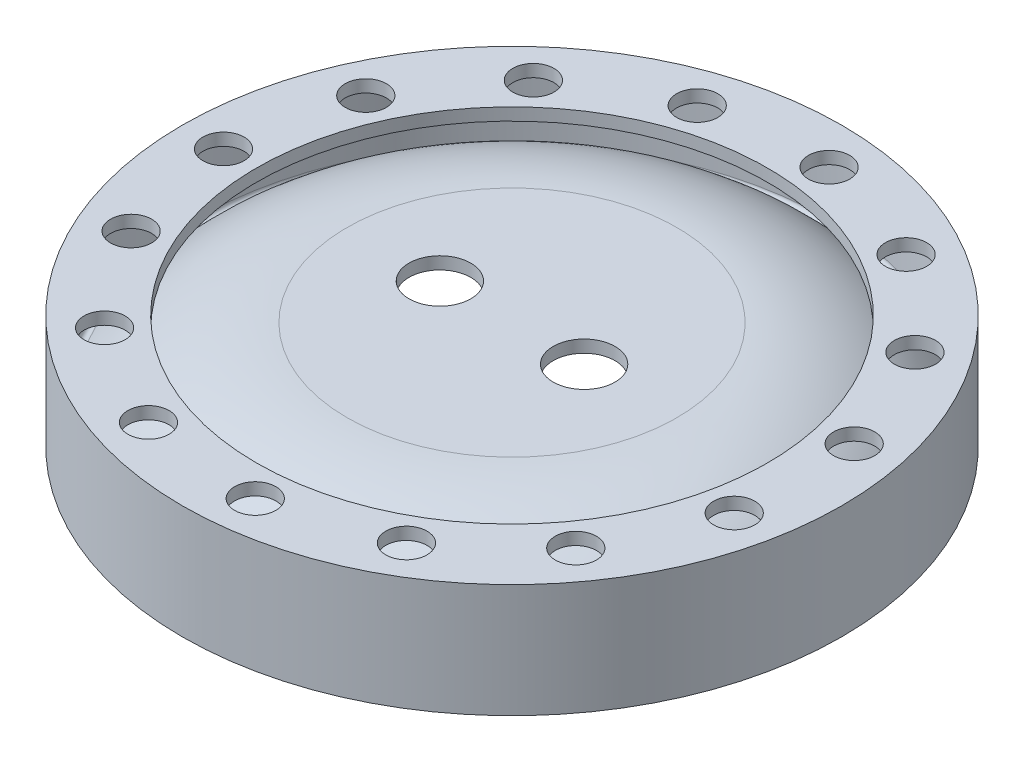
ISO-10303-21;
HEADER;
FILE_DESCRIPTION(('STEP AP214'),'2;1');
FILE_NAME('part.step','',(''),(''),'','','');
FILE_SCHEMA(('AUTOMOTIVE_DESIGN { 1 0 10303 214 1 1 1 1 }'));
ENDSEC;
DATA;
#1=APPLICATION_CONTEXT('core data for automotive mechanical design processes');
#2=APPLICATION_PROTOCOL_DEFINITION('international standard','automotive_design',2000,#1);
#3=PRODUCT_CONTEXT('',#1,'mechanical');
#4=PRODUCT('Part','Part','',(#3));
#5=PRODUCT_RELATED_PRODUCT_CATEGORY('part','',(#4));
#6=PRODUCT_DEFINITION_FORMATION('','',#4);
#7=PRODUCT_DEFINITION_CONTEXT('part definition',#1,'design');
#8=PRODUCT_DEFINITION('design','',#6,#7);
#9=PRODUCT_DEFINITION_SHAPE('','',#8);
#10=(LENGTH_UNIT() NAMED_UNIT(*) SI_UNIT(.MILLI.,.METRE.));
#11=(NAMED_UNIT(*) PLANE_ANGLE_UNIT() SI_UNIT($,.RADIAN.));
#12=(NAMED_UNIT(*) SI_UNIT($,.STERADIAN.) SOLID_ANGLE_UNIT());
#13=UNCERTAINTY_MEASURE_WITH_UNIT(LENGTH_MEASURE(1.E-05),#10,'distance_accuracy_value','');
#14=(GEOMETRIC_REPRESENTATION_CONTEXT(3) GLOBAL_UNCERTAINTY_ASSIGNED_CONTEXT((#13)) GLOBAL_UNIT_ASSIGNED_CONTEXT((#10,
#11,#12)) REPRESENTATION_CONTEXT('',''));
#15=CARTESIAN_POINT('',(0.,0.,0.));
#16=DIRECTION('',(0.,0.,1.));
#17=DIRECTION('',(1.,0.,0.));
#18=AXIS2_PLACEMENT_3D('',#15,#16,#17);
#19=CARTESIAN_POINT('',(0.,25.4,0.));
#20=DIRECTION('',(0.,-1.,0.));
#21=DIRECTION('',(0.,0.,-1.));
#22=AXIS2_PLACEMENT_3D('',#19,#20,#21);
#23=PLANE('',#22);
#24=CARTESIAN_POINT('',(-22.225,25.4,0.));
#25=DIRECTION('',(0.,1.,0.));
#26=DIRECTION('',(0.,0.,1.));
#27=AXIS2_PLACEMENT_3D('',#24,#25,#26);
#28=CIRCLE('',#27,9.525);
#29=CARTESIAN_POINT('',(-22.225,25.4,9.525));
#30=VERTEX_POINT('',#29);
#31=EDGE_CURVE('E70',#30,#30,#28,.T.);
#32=ORIENTED_EDGE('',*,*,#31,.F.);
#33=EDGE_LOOP('',(#32));
#34=FACE_BOUND('',#33,.T.);
#35=CARTESIAN_POINT('',(22.225,25.4,0.));
#36=DIRECTION('',(0.,1.,0.));
#37=DIRECTION('',(0.,0.,1.));
#38=AXIS2_PLACEMENT_3D('',#35,#36,#37);
#39=CIRCLE('',#38,9.525);
#40=CARTESIAN_POINT('',(22.225,25.4,9.525));
#41=VERTEX_POINT('',#40);
#42=EDGE_CURVE('E97',#41,#41,#39,.T.);
#43=ORIENTED_EDGE('',*,*,#42,.F.);
#44=EDGE_LOOP('',(#43));
#45=FACE_BOUND('',#44,.T.);
#46=CARTESIAN_POINT('',(0.,25.4,0.));
#47=DIRECTION('',(0.,1.,0.));
#48=DIRECTION('',(0.,0.,1.));
#49=AXIS2_PLACEMENT_3D('',#46,#47,#48);
#50=CIRCLE('',#49,50.8);
#51=CARTESIAN_POINT('',(0.,25.4,50.8));
#52=VERTEX_POINT('',#51);
#53=EDGE_CURVE('E60',#52,#52,#50,.T.);
#54=ORIENTED_EDGE('',*,*,#53,.T.);
#55=EDGE_LOOP('',(#54));
#56=FACE_BOUND('',#55,.T.);
#57=ADVANCED_FACE('F36',(#34,#45,#56),#23,.F.);
#58=CARTESIAN_POINT('',(0.,-30.76575,0.));
#59=DIRECTION('',(0.,1.,0.));
#60=DIRECTION('',(0.,0.,1.));
#61=AXIS2_PLACEMENT_3D('',#58,#59,#60);
#62=DEGENERATE_TOROIDAL_SURFACE('',#61,50.8,56.16575,.T.);
#63=CARTESIAN_POINT('',(0.,3.2297187941954,0.));
#64=DIRECTION('',(0.,-1.,0.));
#65=DIRECTION('',(0.,0.,-1.));
#66=AXIS2_PLACEMENT_3D('',#63,#64,#65);
#67=CIRCLE('',#66,95.5090547263681);
#68=CARTESIAN_POINT('',(0.,3.2297187941954,-95.5090547263681));
#69=VERTEX_POINT('',#68);
#70=EDGE_CURVE('E10',#69,#69,#67,.F.);
#71=ORIENTED_EDGE('',*,*,#70,.T.);
#72=EDGE_LOOP('',(#71));
#73=FACE_BOUND('',#72,.T.);
#74=ORIENTED_EDGE('',*,*,#53,.F.);
#75=EDGE_LOOP('',(#74));
#76=FACE_BOUND('',#75,.T.);
#77=ADVANCED_FACE('F280',(#73,#76),#62,.T.);
#78=CARTESIAN_POINT('',(0.,25.4,0.));
#79=DIRECTION('',(0.,1.,0.));
#80=DIRECTION('',(0.,0.,1.));
#81=AXIS2_PLACEMENT_3D('',#78,#79,#80);
#82=CYLINDRICAL_SURFACE('',#81,97.79);
#83=CARTESIAN_POINT('',(0.,22.225,0.));
#84=DIRECTION('',(0.,1.,0.));
#85=DIRECTION('',(0.,0.,1.));
#86=AXIS2_PLACEMENT_3D('',#83,#84,#85);
#87=CIRCLE('',#86,97.79);
#88=CARTESIAN_POINT('',(0.,22.225,97.79));
#89=VERTEX_POINT('',#88);
#90=EDGE_CURVE('E49',#89,#89,#87,.T.);
#91=ORIENTED_EDGE('',*,*,#90,.T.);
#92=EDGE_LOOP('',(#91));
#93=FACE_BOUND('',#92,.T.);
#94=CARTESIAN_POINT('',(0.,3.99841226608225,0.));
#95=DIRECTION('',(0.,1.,0.));
#96=DIRECTION('',(0.,0.,1.));
#97=AXIS2_PLACEMENT_3D('',#94,#95,#96);
#98=CIRCLE('',#97,97.79);
#99=CARTESIAN_POINT('',(0.,3.99841226608225,97.79));
#100=VERTEX_POINT('',#99);
#101=EDGE_CURVE('E54',#100,#100,#98,.F.);
#102=ORIENTED_EDGE('',*,*,#101,.T.);
#103=EDGE_LOOP('',(#102));
#104=FACE_BOUND('',#103,.T.);
#105=ADVANCED_FACE('F286',(#93,#104),#82,.F.);
#106=CARTESIAN_POINT('',(97.79,23.495,0.));
#107=DIRECTION('',(0.,1.,0.));
#108=DIRECTION('',(0.,0.,1.));
#109=AXIS2_PLACEMENT_3D('',#106,#107,#108);
#110=PLANE('',#109);
#111=CARTESIAN_POINT('',(0.,23.495,0.));
#112=DIRECTION('',(0.,1.,0.));
#113=DIRECTION('',(0.,0.,1.));
#114=AXIS2_PLACEMENT_3D('',#111,#112,#113);
#115=CIRCLE('',#114,96.52);
#116=CARTESIAN_POINT('',(0.,23.495,96.52));
#117=VERTEX_POINT('',#116);
#118=EDGE_CURVE('E44',#117,#117,#115,.F.);
#119=ORIENTED_EDGE('',*,*,#118,.T.);
#120=EDGE_LOOP('',(#119));
#121=FACE_BOUND('',#120,.T.);
#122=CARTESIAN_POINT('',(-59.4857109053024,23.495,66.0655749849405));
#123=DIRECTION('',(0.,1.,0.));
#124=DIRECTION('',(0.,0.,1.));
#125=AXIS2_PLACEMENT_3D('',#122,#123,#124);
#126=CIRCLE('',#125,6.35);
#127=CARTESIAN_POINT('',(-59.4857109053024,23.495,72.4155749849405));
#128=VERTEX_POINT('',#127);
#129=EDGE_CURVE('E120',#128,#128,#126,.F.);
#130=ORIENTED_EDGE('',*,*,#129,.F.);
#131=EDGE_LOOP('',(#130));
#132=FACE_BOUND('',#131,.T.);
#133=CARTESIAN_POINT('',(-27.4716107999326,23.495,84.5489242986392));
#134=DIRECTION('',(0.,1.,0.));
#135=DIRECTION('',(0.,0.,1.));
#136=AXIS2_PLACEMENT_3D('',#133,#134,#135);
#137=CIRCLE('',#136,6.35);
#138=CARTESIAN_POINT('',(-27.4716107999326,23.495,90.8989242986392));
#139=VERTEX_POINT('',#138);
#140=EDGE_CURVE('E171',#139,#139,#137,.F.);
#141=ORIENTED_EDGE('',*,*,#140,.F.);
#142=EDGE_LOOP('',(#141));
#143=FACE_BOUND('',#142,.T.);
#144=CARTESIAN_POINT('',(9.29258038449473,23.495,88.4129964982395));
#145=DIRECTION('',(0.,1.,0.));
#146=DIRECTION('',(0.,0.,1.));
#147=AXIS2_PLACEMENT_3D('',#144,#145,#146);
#148=CIRCLE('',#147,6.35);
#149=CARTESIAN_POINT('',(9.29258038449473,23.495,94.7629964982394));
#150=VERTEX_POINT('',#149);
#151=EDGE_CURVE('E163',#150,#150,#148,.F.);
#152=ORIENTED_EDGE('',*,*,#151,.F.);
#153=EDGE_LOOP('',(#152));
#154=FACE_BOUND('',#153,.T.);
#155=CARTESIAN_POINT('',(44.4500000000004,23.495,76.9896583964364));
#156=DIRECTION('',(0.,1.,0.));
#157=DIRECTION('',(0.,0.,1.));
#158=AXIS2_PLACEMENT_3D('',#155,#156,#157);
#159=CIRCLE('',#158,6.35);
#160=CARTESIAN_POINT('',(44.4500000000004,23.495,83.3396583964364));
#161=VERTEX_POINT('',#160);
#162=EDGE_CURVE('E155',#161,#161,#159,.F.);
#163=ORIENTED_EDGE('',*,*,#162,.F.);
#164=EDGE_LOOP('',(#163));
#165=FACE_BOUND('',#164,.T.);
#166=CARTESIAN_POINT('',(71.9216107999331,23.495,52.2541089288005));
#167=DIRECTION('',(0.,1.,0.));
#168=DIRECTION('',(0.,0.,1.));
#169=AXIS2_PLACEMENT_3D('',#166,#167,#168);
#170=CIRCLE('',#169,6.35);
#171=CARTESIAN_POINT('',(71.9216107999331,23.495,58.6041089288005));
#172=VERTEX_POINT('',#171);
#173=EDGE_CURVE('E147',#172,#172,#170,.F.);
#174=ORIENTED_EDGE('',*,*,#173,.F.);
#175=EDGE_LOOP('',(#174));
#176=FACE_BOUND('',#175,.T.);
#177=CARTESIAN_POINT('',(86.9573217052354,23.495,18.4833493136983));
#178=DIRECTION('',(0.,1.,0.));
#179=DIRECTION('',(0.,0.,1.));
#180=AXIS2_PLACEMENT_3D('',#177,#178,#179);
#181=CIRCLE('',#180,6.35);
#182=CARTESIAN_POINT('',(86.9573217052354,23.495,24.8333493136982));
#183=VERTEX_POINT('',#182);
#184=EDGE_CURVE('E139',#183,#183,#181,.F.);
#185=ORIENTED_EDGE('',*,*,#184,.F.);
#186=EDGE_LOOP('',(#185));
#187=FACE_BOUND('',#186,.T.);
#188=CARTESIAN_POINT('',(86.9573217052352,23.495,-18.4833493136994));
#189=DIRECTION('',(0.,1.,0.));
#190=DIRECTION('',(0.,0.,1.));
#191=AXIS2_PLACEMENT_3D('',#188,#189,#190);
#192=CIRCLE('',#191,6.35);
#193=CARTESIAN_POINT('',(86.9573217052352,23.495,-12.1333493136994));
#194=VERTEX_POINT('',#193);
#195=EDGE_CURVE('E131',#194,#194,#192,.F.);
#196=ORIENTED_EDGE('',*,*,#195,.F.);
#197=EDGE_LOOP('',(#196));
#198=FACE_BOUND('',#197,.T.);
#199=CARTESIAN_POINT('',(71.9216107999324,23.495,-52.2541089288015));
#200=DIRECTION('',(0.,1.,0.));
#201=DIRECTION('',(0.,0.,1.));
#202=AXIS2_PLACEMENT_3D('',#199,#200,#201);
#203=CIRCLE('',#202,6.35);
#204=CARTESIAN_POINT('',(71.9216107999324,23.495,-45.9041089288015));
#205=VERTEX_POINT('',#204);
#206=EDGE_CURVE('E121',#205,#205,#203,.F.);
#207=ORIENTED_EDGE('',*,*,#206,.F.);
#208=EDGE_LOOP('',(#207));
#209=FACE_BOUND('',#208,.T.);
#210=CARTESIAN_POINT('',(44.4499999999993,23.495,-76.989658396437));
#211=DIRECTION('',(0.,1.,0.));
#212=DIRECTION('',(0.,0.,1.));
#213=AXIS2_PLACEMENT_3D('',#210,#211,#212);
#214=CIRCLE('',#213,6.35);
#215=CARTESIAN_POINT('',(44.4499999999993,23.495,-70.639658396437));
#216=VERTEX_POINT('',#215);
#217=EDGE_CURVE('E130',#216,#216,#214,.F.);
#218=ORIENTED_EDGE('',*,*,#217,.F.);
#219=EDGE_LOOP('',(#218));
#220=FACE_BOUND('',#219,.T.);
#221=CARTESIAN_POINT('',(9.29258038449351,23.495,-88.4129964982396));
#222=DIRECTION('',(0.,1.,0.));
#223=DIRECTION('',(0.,0.,1.));
#224=AXIS2_PLACEMENT_3D('',#221,#222,#223);
#225=CIRCLE('',#224,6.35);
#226=CARTESIAN_POINT('',(9.29258038449351,23.495,-82.0629964982396));
#227=VERTEX_POINT('',#226);
#228=EDGE_CURVE('E210',#227,#227,#225,.F.);
#229=ORIENTED_EDGE('',*,*,#228,.F.);
#230=EDGE_LOOP('',(#229));
#231=FACE_BOUND('',#230,.T.);
#232=CARTESIAN_POINT('',(-27.4716107999337,23.495,-84.5489242986389));
#233=DIRECTION('',(0.,1.,0.));
#234=DIRECTION('',(0.,0.,1.));
#235=AXIS2_PLACEMENT_3D('',#232,#233,#234);
#236=CIRCLE('',#235,6.35);
#237=CARTESIAN_POINT('',(-27.4716107999337,23.495,-78.1989242986389));
#238=VERTEX_POINT('',#237);
#239=EDGE_CURVE('E202',#238,#238,#236,.F.);
#240=ORIENTED_EDGE('',*,*,#239,.F.);
#241=EDGE_LOOP('',(#240));
#242=FACE_BOUND('',#241,.T.);
#243=CARTESIAN_POINT('',(-59.4857109053033,23.495,-66.0655749849396));
#244=DIRECTION('',(0.,1.,0.));
#245=DIRECTION('',(0.,0.,1.));
#246=AXIS2_PLACEMENT_3D('',#243,#244,#245);
#247=CIRCLE('',#246,6.35);
#248=CARTESIAN_POINT('',(-59.4857109053033,23.495,-59.7155749849396));
#249=VERTEX_POINT('',#248);
#250=EDGE_CURVE('E194',#249,#249,#247,.F.);
#251=ORIENTED_EDGE('',*,*,#250,.F.);
#252=EDGE_LOOP('',(#251));
#253=FACE_BOUND('',#252,.T.);
#254=CARTESIAN_POINT('',(-81.2141911844277,23.495,-36.1588875694376));
#255=DIRECTION('',(0.,1.,0.));
#256=DIRECTION('',(0.,0.,1.));
#257=AXIS2_PLACEMENT_3D('',#254,#255,#256);
#258=CIRCLE('',#257,6.35);
#259=CARTESIAN_POINT('',(-81.2141911844277,23.495,-29.8088875694376));
#260=VERTEX_POINT('',#259);
#261=EDGE_CURVE('E185',#260,#260,#258,.F.);
#262=ORIENTED_EDGE('',*,*,#261,.F.);
#263=EDGE_LOOP('',(#262));
#264=FACE_BOUND('',#263,.T.);
#265=CARTESIAN_POINT('',(-81.2141911844272,23.495,36.1588875694387));
#266=DIRECTION('',(0.,1.,0.));
#267=DIRECTION('',(0.,0.,1.));
#268=AXIS2_PLACEMENT_3D('',#265,#266,#267);
#269=CIRCLE('',#268,6.35);
#270=CARTESIAN_POINT('',(-81.2141911844272,23.495,42.5088875694387));
#271=VERTEX_POINT('',#270);
#272=EDGE_CURVE('E112',#271,#271,#269,.F.);
#273=ORIENTED_EDGE('',*,*,#272,.F.);
#274=EDGE_LOOP('',(#273));
#275=FACE_BOUND('',#274,.T.);
#276=CARTESIAN_POINT('',(-88.9,23.495,0.));
#277=DIRECTION('',(0.,1.,0.));
#278=DIRECTION('',(0.,0.,1.));
#279=AXIS2_PLACEMENT_3D('',#276,#277,#278);
#280=CIRCLE('',#279,6.35);
#281=CARTESIAN_POINT('',(-88.9,23.495,6.35000000000001));
#282=VERTEX_POINT('',#281);
#283=EDGE_CURVE('E101',#282,#282,#280,.F.);
#284=ORIENTED_EDGE('',*,*,#283,.F.);
#285=EDGE_LOOP('',(#284));
#286=FACE_BOUND('',#285,.T.);
#287=CARTESIAN_POINT('',(0.,23.495,0.));
#288=DIRECTION('',(0.,1.,0.));
#289=DIRECTION('',(0.,0.,1.));
#290=AXIS2_PLACEMENT_3D('',#287,#288,#289);
#291=CIRCLE('',#290,78.74);
#292=CARTESIAN_POINT('',(0.,23.495,78.74));
#293=VERTEX_POINT('',#292);
#294=EDGE_CURVE('E74',#293,#293,#291,.T.);
#295=ORIENTED_EDGE('',*,*,#294,.T.);
#296=EDGE_LOOP('',(#295));
#297=FACE_BOUND('',#296,.T.);
#298=ADVANCED_FACE('F308',(#121,#132,#143,#154,#165,#176,#187,#198,#209,#220,#231,#242,#253,
#264,#275,#286,#297),#110,.F.);
#299=CARTESIAN_POINT('',(0.,25.4,0.));
#300=DIRECTION('',(0.,1.,0.));
#301=DIRECTION('',(0.,0.,1.));
#302=AXIS2_PLACEMENT_3D('',#299,#300,#301);
#303=CYLINDRICAL_SURFACE('',#302,78.74);
#304=ORIENTED_EDGE('',*,*,#294,.F.);
#305=EDGE_LOOP('',(#304));
#306=FACE_BOUND('',#305,.T.);
#307=CARTESIAN_POINT('',(0.,27.305,0.));
#308=DIRECTION('',(0.,1.,0.));
#309=DIRECTION('',(0.,0.,1.));
#310=AXIS2_PLACEMENT_3D('',#307,#308,#309);
#311=CIRCLE('',#310,78.74);
#312=CARTESIAN_POINT('',(0.,27.305,78.74));
#313=VERTEX_POINT('',#312);
#314=EDGE_CURVE('E78',#313,#313,#311,.T.);
#315=ORIENTED_EDGE('',*,*,#314,.T.);
#316=EDGE_LOOP('',(#315));
#317=FACE_BOUND('',#316,.T.);
#318=ADVANCED_FACE('F231',(#306,#317),#303,.F.);
#319=CARTESIAN_POINT('',(101.6,27.305,0.));
#320=DIRECTION('',(0.,-1.,0.));
#321=DIRECTION('',(0.,0.,-1.));
#322=AXIS2_PLACEMENT_3D('',#319,#320,#321);
#323=PLANE('',#322);
#324=CARTESIAN_POINT('',(-59.4857109053024,27.305,66.0655749849405));
#325=DIRECTION('',(0.,1.,0.));
#326=DIRECTION('',(0.743144825477395,0.,0.669130606358857));
#327=AXIS2_PLACEMENT_3D('',#324,#325,#326);
#328=CIRCLE('',#327,6.35);
#329=CARTESIAN_POINT('',(-54.7667412635209,27.305,70.3145543353192));
#330=VERTEX_POINT('',#329);
#331=EDGE_CURVE('E175',#330,#330,#328,.T.);
#332=ORIENTED_EDGE('',*,*,#331,.F.);
#333=EDGE_LOOP('',(#332));
#334=FACE_BOUND('',#333,.T.);
#335=CARTESIAN_POINT('',(-27.4716107999326,27.305,84.5489242986392));
#336=DIRECTION('',(0.,1.,0.));
#337=DIRECTION('',(0.951056516295154,0.,0.309016994374945));
#338=AXIS2_PLACEMENT_3D('',#335,#336,#337);
#339=CIRCLE('',#338,6.35);
#340=CARTESIAN_POINT('',(-21.4324019214584,27.305,86.5111822129201));
#341=VERTEX_POINT('',#340);
#342=EDGE_CURVE('E167',#341,#341,#339,.T.);
#343=ORIENTED_EDGE('',*,*,#342,.F.);
#344=EDGE_LOOP('',(#343));
#345=FACE_BOUND('',#344,.T.);
#346=CARTESIAN_POINT('',(9.29258038449473,27.305,88.4129964982395));
#347=DIRECTION('',(0.,1.,0.));
#348=DIRECTION('',(0.994521895368273,0.,-0.104528463267657));
#349=AXIS2_PLACEMENT_3D('',#346,#347,#348);
#350=CIRCLE('',#349,6.35);
#351=CARTESIAN_POINT('',(15.6077944200833,27.305,87.7492407564898));
#352=VERTEX_POINT('',#351);
#353=EDGE_CURVE('E159',#352,#352,#350,.T.);
#354=ORIENTED_EDGE('',*,*,#353,.F.);
#355=EDGE_LOOP('',(#354));
#356=FACE_BOUND('',#355,.T.);
#357=CARTESIAN_POINT('',(44.4500000000004,27.305,76.9896583964364));
#358=DIRECTION('',(0.,1.,0.));
#359=DIRECTION('',(0.866025403784436,0.,-0.500000000000004));
#360=AXIS2_PLACEMENT_3D('',#357,#358,#359);
#361=CIRCLE('',#360,6.35);
#362=CARTESIAN_POINT('',(49.9492613140315,27.305,73.8146583964364));
#363=VERTEX_POINT('',#362);
#364=EDGE_CURVE('E151',#363,#363,#361,.T.);
#365=ORIENTED_EDGE('',*,*,#364,.F.);
#366=EDGE_LOOP('',(#365));
#367=FACE_BOUND('',#366,.T.);
#368=CARTESIAN_POINT('',(71.9216107999331,27.305,52.2541089288005));
#369=DIRECTION('',(0.,1.,0.));
#370=DIRECTION('',(0.587785252292469,0.,-0.80901699437495));
#371=AXIS2_PLACEMENT_3D('',#368,#369,#370);
#372=CIRCLE('',#371,6.35);
#373=CARTESIAN_POINT('',(75.6540471519903,27.305,47.1168510145195));
#374=VERTEX_POINT('',#373);
#375=EDGE_CURVE('E143',#374,#374,#372,.T.);
#376=ORIENTED_EDGE('',*,*,#375,.F.);
#377=EDGE_LOOP('',(#376));
#378=FACE_BOUND('',#377,.T.);
#379=CARTESIAN_POINT('',(86.9573217052354,27.305,18.4833493136983));
#380=DIRECTION('',(0.,1.,0.));
#381=DIRECTION('',(0.207911690817753,0.,-0.978147600733807));
#382=AXIS2_PLACEMENT_3D('',#379,#380,#381);
#383=CIRCLE('',#382,6.35);
#384=CARTESIAN_POINT('',(88.2775609419282,27.305,12.2721120490386));
#385=VERTEX_POINT('',#384);
#386=EDGE_CURVE('E135',#385,#385,#383,.T.);
#387=ORIENTED_EDGE('',*,*,#386,.F.);
#388=EDGE_LOOP('',(#387));
#389=FACE_BOUND('',#388,.T.);
#390=CARTESIAN_POINT('',(86.9573217052352,27.305,-18.4833493136994));
#391=DIRECTION('',(0.,1.,0.));
#392=DIRECTION('',(-0.207911690817766,0.,-0.978147600733804));
#393=AXIS2_PLACEMENT_3D('',#390,#391,#392);
#394=CIRCLE('',#393,6.35);
#395=CARTESIAN_POINT('',(85.6370824685424,27.305,-24.6945865783591));
#396=VERTEX_POINT('',#395);
#397=EDGE_CURVE('E125',#396,#396,#394,.T.);
#398=ORIENTED_EDGE('',*,*,#397,.F.);
#399=EDGE_LOOP('',(#398));
#400=FACE_BOUND('',#399,.T.);
#401=CARTESIAN_POINT('',(71.9216107999324,27.305,-52.2541089288015));
#402=DIRECTION('',(0.,1.,0.));
#403=DIRECTION('',(-0.58778525229248,0.,-0.809016994374943));
#404=AXIS2_PLACEMENT_3D('',#401,#402,#403);
#405=CIRCLE('',#404,6.35);
#406=CARTESIAN_POINT('',(68.1891744478751,27.305,-57.3913668430823));
#407=VERTEX_POINT('',#406);
#408=EDGE_CURVE('E126',#407,#407,#405,.T.);
#409=ORIENTED_EDGE('',*,*,#408,.F.);
#410=EDGE_LOOP('',(#409));
#411=FACE_BOUND('',#410,.T.);
#412=CARTESIAN_POINT('',(44.4499999999993,27.305,-76.989658396437));
#413=DIRECTION('',(0.,1.,0.));
#414=DIRECTION('',(-0.866025403784443,0.,-0.499999999999992));
#415=AXIS2_PLACEMENT_3D('',#412,#413,#414);
#416=CIRCLE('',#415,6.35);
#417=CARTESIAN_POINT('',(38.9507386859681,27.305,-80.1646583964369));
#418=VERTEX_POINT('',#417);
#419=EDGE_CURVE('E214',#418,#418,#416,.T.);
#420=ORIENTED_EDGE('',*,*,#419,.F.);
#421=EDGE_LOOP('',(#420));
#422=FACE_BOUND('',#421,.T.);
#423=CARTESIAN_POINT('',(9.29258038449351,27.305,-88.4129964982396));
#424=DIRECTION('',(0.,1.,0.));
#425=DIRECTION('',(-0.994521895368274,0.,-0.104528463267644));
#426=AXIS2_PLACEMENT_3D('',#423,#424,#425);
#427=CIRCLE('',#426,6.35);
#428=CARTESIAN_POINT('',(2.97736634890497,27.305,-89.0767522399891));
#429=VERTEX_POINT('',#428);
#430=EDGE_CURVE('E206',#429,#429,#427,.T.);
#431=ORIENTED_EDGE('',*,*,#430,.F.);
#432=EDGE_LOOP('',(#431));
#433=FACE_BOUND('',#432,.T.);
#434=CARTESIAN_POINT('',(-27.4716107999337,27.305,-84.5489242986389));
#435=DIRECTION('',(0.,1.,0.));
#436=DIRECTION('',(-0.95105651629515,0.,0.309016994374957));
#437=AXIS2_PLACEMENT_3D('',#434,#435,#436);
#438=CIRCLE('',#437,6.35);
#439=CARTESIAN_POINT('',(-33.5108196784079,27.305,-82.5866663843579));
#440=VERTEX_POINT('',#439);
#441=EDGE_CURVE('E198',#440,#440,#438,.T.);
#442=ORIENTED_EDGE('',*,*,#441,.F.);
#443=EDGE_LOOP('',(#442));
#444=FACE_BOUND('',#443,.T.);
#445=CARTESIAN_POINT('',(-59.4857109053033,27.305,-66.0655749849396));
#446=DIRECTION('',(0.,1.,0.));
#447=DIRECTION('',(-0.743144825477386,0.,0.669130606358867));
#448=AXIS2_PLACEMENT_3D('',#445,#446,#447);
#449=CIRCLE('',#448,6.35);
#450=CARTESIAN_POINT('',(-64.2046805470847,27.305,-61.8165956345608));
#451=VERTEX_POINT('',#450);
#452=EDGE_CURVE('E189',#451,#451,#449,.T.);
#453=ORIENTED_EDGE('',*,*,#452,.F.);
#454=EDGE_LOOP('',(#453));
#455=FACE_BOUND('',#454,.T.);
#456=CARTESIAN_POINT('',(-81.2141911844277,27.305,-36.1588875694376));
#457=DIRECTION('',(0.,1.,0.));
#458=DIRECTION('',(-0.406736643075789,0.,0.913545457642606));
#459=AXIS2_PLACEMENT_3D('',#456,#457,#458);
#460=CIRCLE('',#459,6.35);
#461=CARTESIAN_POINT('',(-83.7969688679589,27.305,-30.3578739134071));
#462=VERTEX_POINT('',#461);
#463=EDGE_CURVE('E190',#462,#462,#460,.T.);
#464=ORIENTED_EDGE('',*,*,#463,.F.);
#465=EDGE_LOOP('',(#464));
#466=FACE_BOUND('',#465,.T.);
#467=CARTESIAN_POINT('',(-81.2141911844272,27.305,36.1588875694387));
#468=DIRECTION('',(0.,1.,0.));
#469=DIRECTION('',(0.406736643075801,0.,0.913545457642601));
#470=AXIS2_PLACEMENT_3D('',#467,#468,#469);
#471=CIRCLE('',#470,6.35);
#472=CARTESIAN_POINT('',(-78.6314135008958,27.305,41.9599012254692));
#473=VERTEX_POINT('',#472);
#474=EDGE_CURVE('E116',#473,#473,#471,.T.);
#475=ORIENTED_EDGE('',*,*,#474,.F.);
#476=EDGE_LOOP('',(#475));
#477=FACE_BOUND('',#476,.T.);
#478=CARTESIAN_POINT('',(-88.9,27.305,0.));
#479=DIRECTION('',(0.,1.,0.));
#480=DIRECTION('',(0.,0.,1.));
#481=AXIS2_PLACEMENT_3D('',#478,#479,#480);
#482=CIRCLE('',#481,6.35);
#483=CARTESIAN_POINT('',(-88.9,27.305,6.35000000000001));
#484=VERTEX_POINT('',#483);
#485=EDGE_CURVE('E108',#484,#484,#482,.T.);
#486=ORIENTED_EDGE('',*,*,#485,.F.);
#487=EDGE_LOOP('',(#486));
#488=FACE_BOUND('',#487,.T.);
#489=ORIENTED_EDGE('',*,*,#314,.F.);
#490=EDGE_LOOP('',(#489));
#491=FACE_BOUND('',#490,.T.);
#492=CARTESIAN_POINT('',(0.,27.305,0.));
#493=DIRECTION('',(0.,1.,0.));
#494=DIRECTION('',(0.,0.,1.));
#495=AXIS2_PLACEMENT_3D('',#492,#493,#494);
#496=CIRCLE('',#495,101.6);
#497=CARTESIAN_POINT('',(0.,27.305,101.6));
#498=VERTEX_POINT('',#497);
#499=EDGE_CURVE('E82',#498,#498,#496,.T.);
#500=ORIENTED_EDGE('',*,*,#499,.T.);
#501=EDGE_LOOP('',(#500));
#502=FACE_BOUND('',#501,.T.);
#503=ADVANCED_FACE('F227',(#334,#345,#356,#367,#378,#389,#400,#411,#422,#433,#444,#455,#466,
#477,#488,#491,#502),#323,.F.);
#504=CARTESIAN_POINT('',(0.,25.4,0.));
#505=DIRECTION('',(0.,1.,0.));
#506=DIRECTION('',(0.,0.,1.));
#507=AXIS2_PLACEMENT_3D('',#504,#505,#506);
#508=CYLINDRICAL_SURFACE('',#507,101.6);
#509=ORIENTED_EDGE('',*,*,#499,.F.);
#510=EDGE_LOOP('',(#509));
#511=FACE_BOUND('',#510,.T.);
#512=CARTESIAN_POINT('',(0.,-7.67756128666648,0.));
#513=DIRECTION('',(0.,1.,0.));
#514=DIRECTION('',(0.,0.,1.));
#515=AXIS2_PLACEMENT_3D('',#512,#513,#514);
#516=CIRCLE('',#515,101.6);
#517=CARTESIAN_POINT('',(0.,-7.67756128666648,101.6));
#518=VERTEX_POINT('',#517);
#519=EDGE_CURVE('E86',#518,#518,#516,.T.);
#520=ORIENTED_EDGE('',*,*,#519,.T.);
#521=EDGE_LOOP('',(#520));
#522=FACE_BOUND('',#521,.T.);
#523=ADVANCED_FACE('F230',(#511,#522),#508,.T.);
#524=CARTESIAN_POINT('',(97.79,-7.67756128666649,0.));
#525=DIRECTION('',(0.,1.,0.));
#526=DIRECTION('',(0.,0.,1.));
#527=AXIS2_PLACEMENT_3D('',#524,#525,#526);
#528=PLANE('',#527);
#529=ORIENTED_EDGE('',*,*,#519,.F.);
#530=EDGE_LOOP('',(#529));
#531=FACE_BOUND('',#530,.T.);
#532=CARTESIAN_POINT('',(0.,-7.67756128666648,0.));
#533=DIRECTION('',(0.,1.,0.));
#534=DIRECTION('',(0.,0.,1.));
#535=AXIS2_PLACEMENT_3D('',#532,#533,#534);
#536=CIRCLE('',#535,97.79);
#537=CARTESIAN_POINT('',(0.,-7.67756128666648,97.79));
#538=VERTEX_POINT('',#537);
#539=EDGE_CURVE('E90',#538,#538,#536,.T.);
#540=ORIENTED_EDGE('',*,*,#539,.T.);
#541=EDGE_LOOP('',(#540));
#542=FACE_BOUND('',#541,.T.);
#543=ADVANCED_FACE('F252',(#531,#542),#528,.F.);
#544=CARTESIAN_POINT('',(0.,-30.76575,0.));
#545=DIRECTION('',(0.,1.,0.));
#546=DIRECTION('',(0.,0.,1.));
#547=AXIS2_PLACEMENT_3D('',#544,#545,#546);
#548=DEGENERATE_TOROIDAL_SURFACE('',#547,50.8,52.35575,.T.);
#549=ORIENTED_EDGE('',*,*,#539,.F.);
#550=EDGE_LOOP('',(#549));
#551=FACE_BOUND('',#550,.T.);
#552=CARTESIAN_POINT('',(0.,21.59,0.));
#553=DIRECTION('',(0.,1.,0.));
#554=DIRECTION('',(0.,0.,1.));
#555=AXIS2_PLACEMENT_3D('',#552,#553,#554);
#556=CIRCLE('',#555,50.8);
#557=CARTESIAN_POINT('',(0.,21.59,50.8));
#558=VERTEX_POINT('',#557);
#559=EDGE_CURVE('E65',#558,#558,#556,.T.);
#560=ORIENTED_EDGE('',*,*,#559,.T.);
#561=EDGE_LOOP('',(#560));
#562=FACE_BOUND('',#561,.T.);
#563=ADVANCED_FACE('F258',(#551,#562),#548,.F.);
#564=CARTESIAN_POINT('',(0.,21.59,0.));
#565=DIRECTION('',(0.,1.,0.));
#566=DIRECTION('',(0.,0.,1.));
#567=AXIS2_PLACEMENT_3D('',#564,#565,#566);
#568=PLANE('',#567);
#569=CARTESIAN_POINT('',(-22.225,21.59,0.));
#570=DIRECTION('',(0.,1.,0.));
#571=DIRECTION('',(0.,0.,1.));
#572=AXIS2_PLACEMENT_3D('',#569,#570,#571);
#573=CIRCLE('',#572,9.525);
#574=CARTESIAN_POINT('',(-22.225,21.59,9.525));
#575=VERTEX_POINT('',#574);
#576=EDGE_CURVE('E61',#575,#575,#573,.T.);
#577=ORIENTED_EDGE('',*,*,#576,.T.);
#578=EDGE_LOOP('',(#577));
#579=FACE_BOUND('',#578,.T.);
#580=CARTESIAN_POINT('',(22.225,21.59,0.));
#581=DIRECTION('',(0.,1.,0.));
#582=DIRECTION('',(0.,0.,1.));
#583=AXIS2_PLACEMENT_3D('',#580,#581,#582);
#584=CIRCLE('',#583,9.525);
#585=CARTESIAN_POINT('',(22.225,21.59,9.525));
#586=VERTEX_POINT('',#585);
#587=EDGE_CURVE('E66',#586,#586,#584,.T.);
#588=ORIENTED_EDGE('',*,*,#587,.T.);
#589=EDGE_LOOP('',(#588));
#590=FACE_BOUND('',#589,.T.);
#591=ORIENTED_EDGE('',*,*,#559,.F.);
#592=EDGE_LOOP('',(#591));
#593=FACE_BOUND('',#592,.T.);
#594=ADVANCED_FACE('F264',(#579,#590,#593),#568,.F.);
#595=CARTESIAN_POINT('',(22.225,-7.67756128666649,0.));
#596=DIRECTION('',(0.,1.,0.));
#597=DIRECTION('',(0.,0.,1.));
#598=AXIS2_PLACEMENT_3D('',#595,#596,#597);
#599=CYLINDRICAL_SURFACE('',#598,9.525);
#600=ORIENTED_EDGE('',*,*,#42,.T.);
#601=EDGE_LOOP('',(#600));
#602=FACE_BOUND('',#601,.T.);
#603=ORIENTED_EDGE('',*,*,#587,.F.);
#604=EDGE_LOOP('',(#603));
#605=FACE_BOUND('',#604,.T.);
#606=ADVANCED_FACE('F269',(#602,#605),#599,.F.);
#607=CARTESIAN_POINT('',(-22.225,-7.67756128666649,0.));
#608=DIRECTION('',(0.,1.,0.));
#609=DIRECTION('',(0.,0.,1.));
#610=AXIS2_PLACEMENT_3D('',#607,#608,#609);
#611=CYLINDRICAL_SURFACE('',#610,9.525);
#612=ORIENTED_EDGE('',*,*,#31,.T.);
#613=EDGE_LOOP('',(#612));
#614=FACE_BOUND('',#613,.T.);
#615=ORIENTED_EDGE('',*,*,#576,.F.);
#616=EDGE_LOOP('',(#615));
#617=FACE_BOUND('',#616,.T.);
#618=ADVANCED_FACE('F275',(#614,#617),#611,.F.);
#619=CARTESIAN_POINT('',(-88.9,5.53448775786168,0.));
#620=DIRECTION('',(0.,1.,0.));
#621=DIRECTION('',(0.,0.,1.));
#622=AXIS2_PLACEMENT_3D('',#619,#620,#621);
#623=CYLINDRICAL_SURFACE('',#622,6.35);
#624=ORIENTED_EDGE('',*,*,#283,.T.);
#625=EDGE_LOOP('',(#624));
#626=FACE_BOUND('',#625,.T.);
#627=ORIENTED_EDGE('',*,*,#485,.T.);
#628=EDGE_LOOP('',(#627));
#629=FACE_BOUND('',#628,.T.);
#630=ADVANCED_FACE('F366',(#626,#629),#623,.F.);
#631=CARTESIAN_POINT('',(-81.2141911844272,5.53448775786168,36.1588875694387));
#632=DIRECTION('',(0.,1.,0.));
#633=DIRECTION('',(0.,0.,1.));
#634=AXIS2_PLACEMENT_3D('',#631,#632,#633);
#635=CYLINDRICAL_SURFACE('',#634,6.35);
#636=ORIENTED_EDGE('',*,*,#272,.T.);
#637=EDGE_LOOP('',(#636));
#638=FACE_BOUND('',#637,.T.);
#639=ORIENTED_EDGE('',*,*,#474,.T.);
#640=EDGE_LOOP('',(#639));
#641=FACE_BOUND('',#640,.T.);
#642=ADVANCED_FACE('F375',(#638,#641),#635,.F.);
#643=CARTESIAN_POINT('',(-81.2141911844277,5.53448775786168,-36.1588875694376));
#644=DIRECTION('',(0.,1.,0.));
#645=DIRECTION('',(0.,0.,1.));
#646=AXIS2_PLACEMENT_3D('',#643,#644,#645);
#647=CYLINDRICAL_SURFACE('',#646,6.35);
#648=ORIENTED_EDGE('',*,*,#261,.T.);
#649=EDGE_LOOP('',(#648));
#650=FACE_BOUND('',#649,.T.);
#651=ORIENTED_EDGE('',*,*,#463,.T.);
#652=EDGE_LOOP('',(#651));
#653=FACE_BOUND('',#652,.T.);
#654=ADVANCED_FACE('F385',(#650,#653),#647,.F.);
#655=CARTESIAN_POINT('',(-59.4857109053033,5.53448775786168,-66.0655749849396));
#656=DIRECTION('',(0.,1.,0.));
#657=DIRECTION('',(0.,0.,1.));
#658=AXIS2_PLACEMENT_3D('',#655,#656,#657);
#659=CYLINDRICAL_SURFACE('',#658,6.35);
#660=ORIENTED_EDGE('',*,*,#250,.T.);
#661=EDGE_LOOP('',(#660));
#662=FACE_BOUND('',#661,.T.);
#663=ORIENTED_EDGE('',*,*,#452,.T.);
#664=EDGE_LOOP('',(#663));
#665=FACE_BOUND('',#664,.T.);
#666=ADVANCED_FACE('F392',(#662,#665),#659,.F.);
#667=CARTESIAN_POINT('',(-27.4716107999337,5.53448775786168,-84.5489242986389));
#668=DIRECTION('',(0.,1.,0.));
#669=DIRECTION('',(0.,0.,1.));
#670=AXIS2_PLACEMENT_3D('',#667,#668,#669);
#671=CYLINDRICAL_SURFACE('',#670,6.35);
#672=ORIENTED_EDGE('',*,*,#239,.T.);
#673=EDGE_LOOP('',(#672));
#674=FACE_BOUND('',#673,.T.);
#675=ORIENTED_EDGE('',*,*,#441,.T.);
#676=EDGE_LOOP('',(#675));
#677=FACE_BOUND('',#676,.T.);
#678=ADVANCED_FACE('F400',(#674,#677),#671,.F.);
#679=CARTESIAN_POINT('',(9.29258038449351,5.53448775786168,-88.4129964982396));
#680=DIRECTION('',(0.,1.,0.));
#681=DIRECTION('',(0.,0.,1.));
#682=AXIS2_PLACEMENT_3D('',#679,#680,#681);
#683=CYLINDRICAL_SURFACE('',#682,6.35);
#684=ORIENTED_EDGE('',*,*,#228,.T.);
#685=EDGE_LOOP('',(#684));
#686=FACE_BOUND('',#685,.T.);
#687=ORIENTED_EDGE('',*,*,#430,.T.);
#688=EDGE_LOOP('',(#687));
#689=FACE_BOUND('',#688,.T.);
#690=ADVANCED_FACE('F408',(#686,#689),#683,.F.);
#691=CARTESIAN_POINT('',(44.4499999999993,5.53448775786168,-76.989658396437));
#692=DIRECTION('',(0.,1.,0.));
#693=DIRECTION('',(0.,0.,1.));
#694=AXIS2_PLACEMENT_3D('',#691,#692,#693);
#695=CYLINDRICAL_SURFACE('',#694,6.35);
#696=ORIENTED_EDGE('',*,*,#217,.T.);
#697=EDGE_LOOP('',(#696));
#698=FACE_BOUND('',#697,.T.);
#699=ORIENTED_EDGE('',*,*,#419,.T.);
#700=EDGE_LOOP('',(#699));
#701=FACE_BOUND('',#700,.T.);
#702=ADVANCED_FACE('F225',(#698,#701),#695,.F.);
#703=CARTESIAN_POINT('',(71.9216107999324,5.53448775786168,-52.2541089288015));
#704=DIRECTION('',(0.,1.,0.));
#705=DIRECTION('',(0.,0.,1.));
#706=AXIS2_PLACEMENT_3D('',#703,#704,#705);
#707=CYLINDRICAL_SURFACE('',#706,6.35);
#708=ORIENTED_EDGE('',*,*,#206,.T.);
#709=EDGE_LOOP('',(#708));
#710=FACE_BOUND('',#709,.T.);
#711=ORIENTED_EDGE('',*,*,#408,.T.);
#712=EDGE_LOOP('',(#711));
#713=FACE_BOUND('',#712,.T.);
#714=ADVANCED_FACE('F423',(#710,#713),#707,.F.);
#715=CARTESIAN_POINT('',(86.9573217052352,5.53448775786168,-18.4833493136994));
#716=DIRECTION('',(0.,1.,0.));
#717=DIRECTION('',(0.,0.,1.));
#718=AXIS2_PLACEMENT_3D('',#715,#716,#717);
#719=CYLINDRICAL_SURFACE('',#718,6.35);
#720=ORIENTED_EDGE('',*,*,#195,.T.);
#721=EDGE_LOOP('',(#720));
#722=FACE_BOUND('',#721,.T.);
#723=ORIENTED_EDGE('',*,*,#397,.T.);
#724=EDGE_LOOP('',(#723));
#725=FACE_BOUND('',#724,.T.);
#726=ADVANCED_FACE('F431',(#722,#725),#719,.F.);
#727=CARTESIAN_POINT('',(86.9573217052354,5.53448775786168,18.4833493136983));
#728=DIRECTION('',(0.,1.,0.));
#729=DIRECTION('',(0.,0.,1.));
#730=AXIS2_PLACEMENT_3D('',#727,#728,#729);
#731=CYLINDRICAL_SURFACE('',#730,6.35);
#732=ORIENTED_EDGE('',*,*,#184,.T.);
#733=EDGE_LOOP('',(#732));
#734=FACE_BOUND('',#733,.T.);
#735=ORIENTED_EDGE('',*,*,#386,.T.);
#736=EDGE_LOOP('',(#735));
#737=FACE_BOUND('',#736,.T.);
#738=ADVANCED_FACE('F439',(#734,#737),#731,.F.);
#739=CARTESIAN_POINT('',(71.9216107999331,5.53448775786168,52.2541089288005));
#740=DIRECTION('',(0.,1.,0.));
#741=DIRECTION('',(0.,0.,1.));
#742=AXIS2_PLACEMENT_3D('',#739,#740,#741);
#743=CYLINDRICAL_SURFACE('',#742,6.35);
#744=ORIENTED_EDGE('',*,*,#173,.T.);
#745=EDGE_LOOP('',(#744));
#746=FACE_BOUND('',#745,.T.);
#747=ORIENTED_EDGE('',*,*,#375,.T.);
#748=EDGE_LOOP('',(#747));
#749=FACE_BOUND('',#748,.T.);
#750=ADVANCED_FACE('F447',(#746,#749),#743,.F.);
#751=CARTESIAN_POINT('',(44.4500000000004,5.53448775786168,76.9896583964364));
#752=DIRECTION('',(0.,1.,0.));
#753=DIRECTION('',(0.,0.,1.));
#754=AXIS2_PLACEMENT_3D('',#751,#752,#753);
#755=CYLINDRICAL_SURFACE('',#754,6.35);
#756=ORIENTED_EDGE('',*,*,#162,.T.);
#757=EDGE_LOOP('',(#756));
#758=FACE_BOUND('',#757,.T.);
#759=ORIENTED_EDGE('',*,*,#364,.T.);
#760=EDGE_LOOP('',(#759));
#761=FACE_BOUND('',#760,.T.);
#762=ADVANCED_FACE('F455',(#758,#761),#755,.F.);
#763=CARTESIAN_POINT('',(9.29258038449473,5.53448775786168,88.4129964982395));
#764=DIRECTION('',(0.,1.,0.));
#765=DIRECTION('',(0.,0.,1.));
#766=AXIS2_PLACEMENT_3D('',#763,#764,#765);
#767=CYLINDRICAL_SURFACE('',#766,6.35);
#768=ORIENTED_EDGE('',*,*,#151,.T.);
#769=EDGE_LOOP('',(#768));
#770=FACE_BOUND('',#769,.T.);
#771=ORIENTED_EDGE('',*,*,#353,.T.);
#772=EDGE_LOOP('',(#771));
#773=FACE_BOUND('',#772,.T.);
#774=ADVANCED_FACE('F463',(#770,#773),#767,.F.);
#775=CARTESIAN_POINT('',(-27.4716107999326,5.53448775786168,84.5489242986392));
#776=DIRECTION('',(0.,1.,0.));
#777=DIRECTION('',(0.,0.,1.));
#778=AXIS2_PLACEMENT_3D('',#775,#776,#777);
#779=CYLINDRICAL_SURFACE('',#778,6.35);
#780=ORIENTED_EDGE('',*,*,#140,.T.);
#781=EDGE_LOOP('',(#780));
#782=FACE_BOUND('',#781,.T.);
#783=ORIENTED_EDGE('',*,*,#342,.T.);
#784=EDGE_LOOP('',(#783));
#785=FACE_BOUND('',#784,.T.);
#786=ADVANCED_FACE('F300',(#782,#785),#779,.F.);
#787=CARTESIAN_POINT('',(-59.4857109053024,5.53448775786168,66.0655749849405));
#788=DIRECTION('',(0.,1.,0.));
#789=DIRECTION('',(0.,0.,1.));
#790=AXIS2_PLACEMENT_3D('',#787,#788,#789);
#791=CYLINDRICAL_SURFACE('',#790,6.35);
#792=ORIENTED_EDGE('',*,*,#129,.T.);
#793=EDGE_LOOP('',(#792));
#794=FACE_BOUND('',#793,.T.);
#795=ORIENTED_EDGE('',*,*,#331,.T.);
#796=EDGE_LOOP('',(#795));
#797=FACE_BOUND('',#796,.T.);
#798=ADVANCED_FACE('F293',(#794,#797),#791,.F.);
#799=CARTESIAN_POINT('',(0.,22.225,0.));
#800=DIRECTION('',(0.,1.,0.));
#801=DIRECTION('',(0.,0.,1.));
#802=AXIS2_PLACEMENT_3D('',#799,#800,#801);
#803=TOROIDAL_SURFACE('',#802,96.52,1.27);
#804=ORIENTED_EDGE('',*,*,#118,.F.);
#805=EDGE_LOOP('',(#804));
#806=FACE_BOUND('',#805,.T.);
#807=ORIENTED_EDGE('',*,*,#90,.F.);
#808=EDGE_LOOP('',(#807));
#809=FACE_BOUND('',#808,.T.);
#810=ADVANCED_FACE('F291',(#806,#809),#803,.F.);
#811=CARTESIAN_POINT('',(0.,3.99841226608225,0.));
#812=DIRECTION('',(0.,1.,0.));
#813=DIRECTION('',(0.,0.,1.));
#814=AXIS2_PLACEMENT_3D('',#811,#812,#813);
#815=TOROIDAL_SURFACE('',#814,96.52,1.27);
#816=ORIENTED_EDGE('',*,*,#101,.F.);
#817=EDGE_LOOP('',(#816));
#818=FACE_BOUND('',#817,.T.);
#819=ORIENTED_EDGE('',*,*,#70,.F.);
#820=EDGE_LOOP('',(#819));
#821=FACE_BOUND('',#820,.T.);
#822=ADVANCED_FACE('F38',(#818,#821),#815,.F.);
#823=CLOSED_SHELL('',(#57,#77,#105,#298,#318,#503,#523,#543,#563,#594,#606,#618,#630,#642,#654,
#666,#678,#690,#702,#714,#726,#738,#750,#762,#774,#786,#798,#810,#822));
#824=MANIFOLD_SOLID_BREP('B2',#823);
#825=ADVANCED_BREP_SHAPE_REPRESENTATION('',(#18,#824),#14);
#826=SHAPE_DEFINITION_REPRESENTATION(#9,#825);
ENDSEC;
END-ISO-10303-21;
